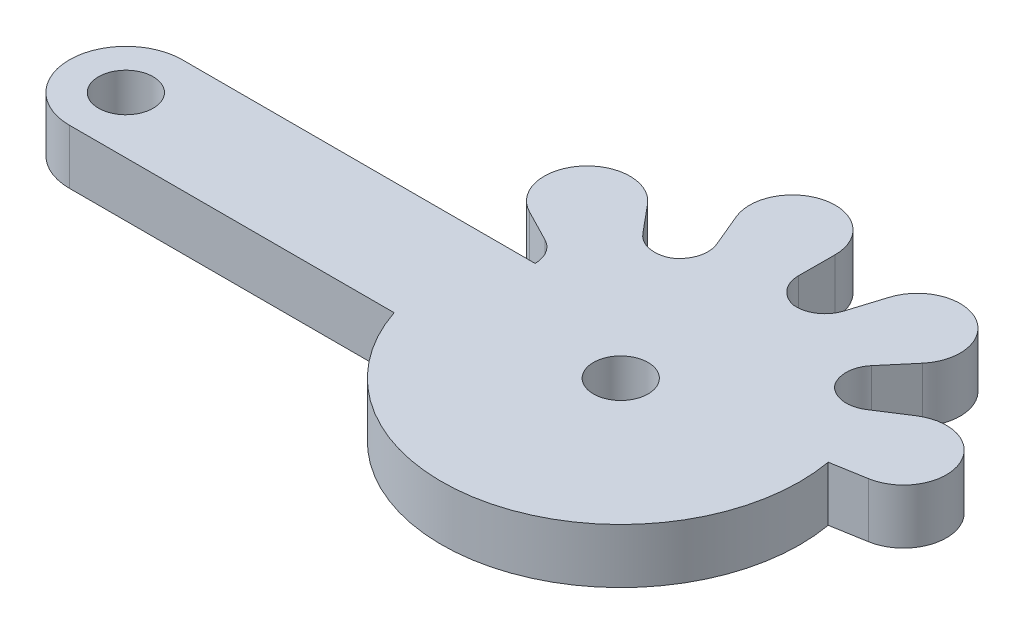
ISO-10303-21;
HEADER;
FILE_DESCRIPTION(('STEP AP214'),'2;1');
FILE_NAME('part.step','',(''),(''),'','','');
FILE_SCHEMA(('AUTOMOTIVE_DESIGN { 1 0 10303 214 1 1 1 1 }'));
ENDSEC;
DATA;
#1=APPLICATION_CONTEXT('core data for automotive mechanical design processes');
#2=APPLICATION_PROTOCOL_DEFINITION('international standard','automotive_design',2000,#1);
#3=PRODUCT_CONTEXT('',#1,'mechanical');
#4=PRODUCT('Part','Part','',(#3));
#5=PRODUCT_RELATED_PRODUCT_CATEGORY('part','',(#4));
#6=PRODUCT_DEFINITION_FORMATION('','',#4);
#7=PRODUCT_DEFINITION_CONTEXT('part definition',#1,'design');
#8=PRODUCT_DEFINITION('design','',#6,#7);
#9=PRODUCT_DEFINITION_SHAPE('','',#8);
#10=(LENGTH_UNIT() NAMED_UNIT(*) SI_UNIT(.MILLI.,.METRE.));
#11=(NAMED_UNIT(*) PLANE_ANGLE_UNIT() SI_UNIT($,.RADIAN.));
#12=(NAMED_UNIT(*) SI_UNIT($,.STERADIAN.) SOLID_ANGLE_UNIT());
#13=UNCERTAINTY_MEASURE_WITH_UNIT(LENGTH_MEASURE(1.E-05),#10,'distance_accuracy_value','');
#14=(GEOMETRIC_REPRESENTATION_CONTEXT(3) GLOBAL_UNCERTAINTY_ASSIGNED_CONTEXT((#13)) GLOBAL_UNIT_ASSIGNED_CONTEXT((#10,
#11,#12)) REPRESENTATION_CONTEXT('',''));
#15=CARTESIAN_POINT('',(0.,0.,0.));
#16=DIRECTION('',(0.,0.,1.));
#17=DIRECTION('',(1.,0.,0.));
#18=AXIS2_PLACEMENT_3D('',#15,#16,#17);
#19=CARTESIAN_POINT('',(-27.1616147689443,3.,0.));
#20=DIRECTION('',(0.,1.,0.));
#21=DIRECTION('',(0.,0.,1.));
#22=AXIS2_PLACEMENT_3D('',#19,#20,#21);
#23=PLANE('',#22);
#24=CARTESIAN_POINT('',(0.,3.,0.));
#25=DIRECTION('',(0.,1.,0.));
#26=DIRECTION('',(0.,0.,1.));
#27=AXIS2_PLACEMENT_3D('',#24,#25,#26);
#28=CIRCLE('',#27,1.5);
#29=CARTESIAN_POINT('',(0.,3.,1.5));
#30=VERTEX_POINT('',#29);
#31=EDGE_CURVE('E224',#30,#30,#28,.T.);
#32=ORIENTED_EDGE('',*,*,#31,.F.);
#33=EDGE_LOOP('',(#32));
#34=FACE_BOUND('',#33,.T.);
#35=CARTESIAN_POINT('',(-27.1616147689443,3.,0.));
#36=DIRECTION('',(0.,1.,0.));
#37=DIRECTION('',(0.,0.,1.));
#38=AXIS2_PLACEMENT_3D('',#35,#36,#37);
#39=CIRCLE('',#38,3.105);
#40=CARTESIAN_POINT('',(-27.1616147689443,3.,-3.105));
#41=VERTEX_POINT('',#40);
#42=CARTESIAN_POINT('',(-27.1616147689443,3.,3.105));
#43=VERTEX_POINT('',#42);
#44=EDGE_CURVE('E265',#41,#43,#39,.T.);
#45=ORIENTED_EDGE('',*,*,#44,.T.);
#46=DIRECTION('',(1.,0.,0.));
#47=VECTOR('',#46,1.);
#48=CARTESIAN_POINT('',(-27.1616147689443,3.,3.105));
#49=LINE('',#48,#47);
#50=CARTESIAN_POINT('',(-9.33199871410192,3.,3.105));
#51=VERTEX_POINT('',#50);
#52=EDGE_CURVE('E138',#43,#51,#49,.T.);
#53=ORIENTED_EDGE('',*,*,#52,.T.);
#54=CARTESIAN_POINT('',(0.,3.,0.));
#55=DIRECTION('',(0.,1.,0.));
#56=DIRECTION('',(0.,0.,1.));
#57=AXIS2_PLACEMENT_3D('',#54,#55,#56);
#58=CIRCLE('',#57,9.835);
#59=CARTESIAN_POINT('',(9.68683946328128,3.,-1.70069580249277));
#60=VERTEX_POINT('',#59);
#61=EDGE_CURVE('E325',#51,#60,#58,.T.);
#62=ORIENTED_EDGE('',*,*,#61,.T.);
#63=DIRECTION('',(0.98547628801862,0.,-0.169813090640984));
#64=VECTOR('',#63,1.);
#65=CARTESIAN_POINT('',(11.5745102547674,3.,-2.02597122018898));
#66=LINE('',#65,#64);
#67=CARTESIAN_POINT('',(11.5745102547674,3.,-2.02597122018898));
#68=VERTEX_POINT('',#67);
#69=EDGE_CURVE('E344',#60,#68,#66,.T.);
#70=ORIENTED_EDGE('',*,*,#69,.T.);
#71=CARTESIAN_POINT('',(11.1748134806221,3.,-4.34553146039787));
#72=DIRECTION('',(0.,1.,0.));
#73=DIRECTION('',(0.,0.,1.));
#74=AXIS2_PLACEMENT_3D('',#71,#72,#73);
#75=CIRCLE('',#74,2.35374535989349);
#76=CARTESIAN_POINT('',(9.90246432928744,3.,-6.32574479645999));
#77=VERTEX_POINT('',#76);
#78=EDGE_CURVE('E341',#68,#77,#75,.T.);
#79=ORIENTED_EDGE('',*,*,#78,.T.);
#80=DIRECTION('',(-0.84130312896367,0.,0.540563636583094));
#81=VECTOR('',#80,1.);
#82=CARTESIAN_POINT('',(8.22739993569904,3.,-5.24946340758131));
#83=LINE('',#82,#81);
#84=CARTESIAN_POINT('',(8.22739993569904,3.,-5.24946340758131));
#85=VERTEX_POINT('',#84);
#86=EDGE_CURVE('E343',#77,#85,#83,.T.);
#87=ORIENTED_EDGE('',*,*,#86,.T.);
#88=CARTESIAN_POINT('',(7.37871502626359,3.,-6.57030932005427));
#89=DIRECTION('',(0.,-1.,0.));
#90=DIRECTION('',(0.,0.,1.));
#91=AXIS2_PLACEMENT_3D('',#88,#89,#90);
#92=CIRCLE('',#91,1.57);
#93=CARTESIAN_POINT('',(6.24896521424157,3.,-5.48009587203768));
#94=VERTEX_POINT('',#93);
#95=EDGE_CURVE('E346',#85,#94,#92,.T.);
#96=ORIENTED_EDGE('',*,*,#95,.T.);
#97=CARTESIAN_POINT('',(7.47733128406035,3.,-6.45785698729946));
#98=DIRECTION('',(0.,-1.,0.));
#99=DIRECTION('',(0.,0.,1.));
#100=AXIS2_PLACEMENT_3D('',#97,#98,#99);
#101=CIRCLE('',#100,1.57);
#102=CARTESIAN_POINT('',(6.27857925846899,3.,-7.47170785460719));
#103=VERTEX_POINT('',#102);
#104=EDGE_CURVE('E352',#94,#103,#101,.T.);
#105=ORIENTED_EDGE('',*,*,#104,.T.);
#106=DIRECTION('',(0.645764883635492,0.,-0.76353632203271));
#107=VECTOR('',#106,1.);
#108=CARTESIAN_POINT('',(7.56432006456824,3.,-8.99193577509988));
#109=LINE('',#108,#107);
#110=CARTESIAN_POINT('',(7.56432006456824,3.,-8.99193577509988));
#111=VERTEX_POINT('',#110);
#112=EDGE_CURVE('E354',#103,#111,#109,.T.);
#113=ORIENTED_EDGE('',*,*,#112,.T.);
#114=CARTESIAN_POINT('',(5.76714998947361,3.,-10.5119018735391));
#115=DIRECTION('',(0.,1.,0.));
#116=DIRECTION('',(0.,0.,1.));
#117=AXIS2_PLACEMENT_3D('',#114,#115,#116);
#118=CIRCLE('',#117,2.35374535989349);
#119=CARTESIAN_POINT('',(3.51961739542973,3.,-11.2109830261462));
#120=VERTEX_POINT('',#119);
#121=EDGE_CURVE('E356',#111,#120,#118,.T.);
#122=ORIENTED_EDGE('',*,*,#121,.T.);
#123=DIRECTION('',(-0.297007979078413,0.,0.954874997245062));
#124=VECTOR('',#123,1.);
#125=CARTESIAN_POINT('',(2.92826396616252,3.,-9.30979301133758));
#126=LINE('',#125,#124);
#127=CARTESIAN_POINT('',(2.92826396616252,3.,-9.30979301133758));
#128=VERTEX_POINT('',#127);
#129=EDGE_CURVE('E358',#120,#128,#126,.T.);
#130=ORIENTED_EDGE('',*,*,#129,.T.);
#131=CARTESIAN_POINT('',(1.42911022048778,3.,-9.77609553849068));
#132=DIRECTION('',(0.,-1.,0.));
#133=DIRECTION('',(0.,0.,1.));
#134=AXIS2_PLACEMENT_3D('',#131,#132,#133);
#135=CIRCLE('',#134,1.57);
#136=CARTESIAN_POINT('',(1.26444735117248,3.,-8.21475440361053));
#137=VERTEX_POINT('',#136);
#138=EDGE_CURVE('E360',#128,#137,#135,.T.);
#139=ORIENTED_EDGE('',*,*,#138,.T.);
#140=CARTESIAN_POINT('',(1.57693762294931,3.,-9.75334136249353));
#141=DIRECTION('',(0.,-1.,0.));
#142=DIRECTION('',(0.,0.,1.));
#143=AXIS2_PLACEMENT_3D('',#140,#141,#142);
#144=CIRCLE('',#143,1.57);
#145=CARTESIAN_POINT('',(0.00694951949208001,3.,-9.75945323640903));
#146=VERTEX_POINT('',#145);
#147=EDGE_CURVE('E362',#137,#146,#144,.T.);
#148=ORIENTED_EDGE('',*,*,#147,.T.);
#149=DIRECTION('',(0.00389291332197502,0.,-0.999992422584225));
#150=VECTOR('',#149,1.);
#151=CARTESIAN_POINT('',(0.0147004481032687,3.,-11.7504736466058));
#152=LINE('',#151,#150);
#153=CARTESIAN_POINT('',(0.0147004481032687,3.,-11.7504736466058));
#154=VERTEX_POINT('',#153);
#155=EDGE_CURVE('E364',#146,#154,#152,.T.);
#156=ORIENTED_EDGE('',*,*,#155,.T.);
#157=CARTESIAN_POINT('',(-2.33902707648301,3.,-11.7596365732738));
#158=DIRECTION('',(0.,1.,0.));
#159=DIRECTION('',(0.,0.,1.));
#160=AXIS2_PLACEMENT_3D('',#157,#158,#159);
#161=CIRCLE('',#160,2.35374535989349);
#162=CARTESIAN_POINT('',(-4.51009763394027,3.,-10.8504777016995));
#163=VERTEX_POINT('',#162);
#164=EDGE_CURVE('E366',#154,#163,#161,.T.);
#165=ORIENTED_EDGE('',*,*,#164,.T.);
#166=DIRECTION('',(0.38626050509368,0.,0.922389734442429));
#167=VECTOR('',#166,1.);
#168=CARTESIAN_POINT('',(-3.74103925717078,3.,-9.01396699826347));
#169=LINE('',#168,#167);
#170=CARTESIAN_POINT('',(-3.74103925717078,3.,-9.01396699826347));
#171=VERTEX_POINT('',#170);
#172=EDGE_CURVE('E368',#163,#171,#169,.T.);
#173=ORIENTED_EDGE('',*,*,#172,.T.);
#174=CARTESIAN_POINT('',(-5.18919114024539,3.,-8.40753800526639));
#175=DIRECTION('',(0.,-1.,0.));
#176=DIRECTION('',(0.,0.,1.));
#177=AXIS2_PLACEMENT_3D('',#174,#175,#176);
#178=CIRCLE('',#177,1.57);
#179=CARTESIAN_POINT('',(-4.31171948027739,3.,-7.10563805290715));
#180=VERTEX_POINT('',#179);
#181=EDGE_CURVE('E370',#171,#180,#178,.T.);
#182=ORIENTED_EDGE('',*,*,#181,.T.);
#183=CARTESIAN_POINT('',(-5.06132267764943,3.,-8.48512891786045));
#184=DIRECTION('',(0.,-1.,0.));
#185=DIRECTION('',(0.,0.,1.));
#186=AXIS2_PLACEMENT_3D('',#183,#184,#185);
#187=CIRCLE('',#186,1.57);
#188=CARTESIAN_POINT('',(-6.26793197689049,3.,-7.48064198465276));
#189=VERTEX_POINT('',#188);
#190=EDGE_CURVE('E372',#180,#189,#187,.T.);
#191=ORIENTED_EDGE('',*,*,#190,.T.);
#192=DIRECTION('',(-0.639800594399805,0.,-0.768540954930612));
#193=VECTOR('',#192,1.);
#194=CARTESIAN_POINT('',(-7.5417976714065,3.,-9.01083430689512));
#195=LINE('',#194,#193);
#196=CARTESIAN_POINT('',(-7.5417976714065,3.,-9.01083430689512));
#197=VERTEX_POINT('',#196);
#198=EDGE_CURVE('E374',#189,#197,#195,.T.);
#199=ORIENTED_EDGE('',*,*,#198,.T.);
#200=CARTESIAN_POINT('',(-9.35074737796255,3.,-7.50490662656948));
#201=DIRECTION('',(0.,1.,0.));
#202=DIRECTION('',(0.,0.,1.));
#203=AXIS2_PLACEMENT_3D('',#200,#201,#202);
#204=CIRCLE('',#203,2.3537453598935);
#205=CARTESIAN_POINT('',(-10.4294878562371,3.,-5.41291327099873));
#206=VERTEX_POINT('',#205);
#207=EDGE_CURVE('E202',#197,#206,#204,.T.);
#208=ORIENTED_EDGE('',*,*,#207,.T.);
#209=DIRECTION('',(0.888793406125044,0.,0.458308063674033));
#210=VECTOR('',#209,1.);
#211=CARTESIAN_POINT('',(-8.65986863505324,3.,-4.50040564761632));
#212=LINE('',#211,#210);
#213=CARTESIAN_POINT('',(-8.65986863505324,3.,-4.50040564761632));
#214=VERTEX_POINT('',#213);
#215=EDGE_CURVE('E196',#206,#214,#212,.T.);
#216=ORIENTED_EDGE('',*,*,#215,.T.);
#217=CARTESIAN_POINT('',(-9.37941229502147,3.,-3.105));
#218=DIRECTION('',(0.,-1.,0.));
#219=DIRECTION('',(0.,0.,1.));
#220=AXIS2_PLACEMENT_3D('',#217,#218,#219);
#221=CIRCLE('',#220,1.57);
#222=CARTESIAN_POINT('',(-7.80941229502147,3.,-3.105));
#223=VERTEX_POINT('',#222);
#224=EDGE_CURVE('E200',#214,#223,#221,.T.);
#225=ORIENTED_EDGE('',*,*,#224,.T.);
#226=DIRECTION('',(-1.,0.,0.));
#227=VECTOR('',#226,1.);
#228=CARTESIAN_POINT('',(-27.1616147689443,3.,-3.105));
#229=LINE('',#228,#227);
#230=EDGE_CURVE('E50',#223,#41,#229,.T.);
#231=ORIENTED_EDGE('',*,*,#230,.T.);
#232=EDGE_LOOP('',(#45,#53,#62,#70,#79,#87,#96,#105,#113,#122,#130,#139,#148,#156,#165,#173,
#182,#191,#199,#208,#216,#225,#231));
#233=FACE_BOUND('',#232,.T.);
#234=CARTESIAN_POINT('',(-27.1616147689443,3.,0.));
#235=DIRECTION('',(0.,1.,0.));
#236=DIRECTION('',(0.,0.,1.));
#237=AXIS2_PLACEMENT_3D('',#234,#235,#236);
#238=CIRCLE('',#237,1.5);
#239=CARTESIAN_POINT('',(-27.1616147689443,3.,1.5));
#240=VERTEX_POINT('',#239);
#241=EDGE_CURVE('E417',#240,#240,#238,.T.);
#242=ORIENTED_EDGE('',*,*,#241,.F.);
#243=EDGE_LOOP('',(#242));
#244=FACE_BOUND('',#243,.T.);
#245=ADVANCED_FACE('F33',(#34,#233,#244),#23,.T.);
#246=CARTESIAN_POINT('',(-27.1616147689443,0.,0.));
#247=DIRECTION('',(0.,1.,0.));
#248=DIRECTION('',(0.,0.,1.));
#249=AXIS2_PLACEMENT_3D('',#246,#247,#248);
#250=PLANE('',#249);
#251=CARTESIAN_POINT('',(0.,0.,0.));
#252=DIRECTION('',(0.,1.,0.));
#253=DIRECTION('',(0.,0.,1.));
#254=AXIS2_PLACEMENT_3D('',#251,#252,#253);
#255=CIRCLE('',#254,1.5);
#256=CARTESIAN_POINT('',(0.,0.,1.5));
#257=VERTEX_POINT('',#256);
#258=EDGE_CURVE('E422',#257,#257,#255,.T.);
#259=ORIENTED_EDGE('',*,*,#258,.T.);
#260=EDGE_LOOP('',(#259));
#261=FACE_BOUND('',#260,.T.);
#262=CARTESIAN_POINT('',(-27.1616147689443,0.,0.));
#263=DIRECTION('',(0.,1.,0.));
#264=DIRECTION('',(0.,0.,1.));
#265=AXIS2_PLACEMENT_3D('',#262,#263,#264);
#266=CIRCLE('',#265,3.105);
#267=CARTESIAN_POINT('',(-27.1616147689443,0.,-3.105));
#268=VERTEX_POINT('',#267);
#269=CARTESIAN_POINT('',(-27.1616147689443,0.,3.105));
#270=VERTEX_POINT('',#269);
#271=EDGE_CURVE('E220',#268,#270,#266,.T.);
#272=ORIENTED_EDGE('',*,*,#271,.F.);
#273=DIRECTION('',(-1.,0.,0.));
#274=VECTOR('',#273,1.);
#275=CARTESIAN_POINT('',(-27.1616147689443,0.,-3.105));
#276=LINE('',#275,#274);
#277=CARTESIAN_POINT('',(-7.80941229502147,0.,-3.105));
#278=VERTEX_POINT('',#277);
#279=EDGE_CURVE('E130',#278,#268,#276,.T.);
#280=ORIENTED_EDGE('',*,*,#279,.F.);
#281=CARTESIAN_POINT('',(-9.37941229502147,0.,-3.105));
#282=DIRECTION('',(0.,-1.,0.));
#283=DIRECTION('',(0.,0.,1.));
#284=AXIS2_PLACEMENT_3D('',#281,#282,#283);
#285=CIRCLE('',#284,1.57);
#286=CARTESIAN_POINT('',(-8.65986863505324,0.,-4.50040564761632));
#287=VERTEX_POINT('',#286);
#288=EDGE_CURVE('E124',#287,#278,#285,.T.);
#289=ORIENTED_EDGE('',*,*,#288,.F.);
#290=DIRECTION('',(0.888793406125044,0.,0.458308063674033));
#291=VECTOR('',#290,1.);
#292=CARTESIAN_POINT('',(-8.65986863505324,0.,-4.50040564761632));
#293=LINE('',#292,#291);
#294=CARTESIAN_POINT('',(-10.4294878562371,0.,-5.41291327099873));
#295=VERTEX_POINT('',#294);
#296=EDGE_CURVE('E210',#295,#287,#293,.T.);
#297=ORIENTED_EDGE('',*,*,#296,.F.);
#298=CARTESIAN_POINT('',(-9.35074737796255,0.,-7.50490662656948));
#299=DIRECTION('',(0.,1.,0.));
#300=DIRECTION('',(0.,0.,1.));
#301=AXIS2_PLACEMENT_3D('',#298,#299,#300);
#302=CIRCLE('',#301,2.3537453598935);
#303=CARTESIAN_POINT('',(-7.5417976714065,0.,-9.01083430689512));
#304=VERTEX_POINT('',#303);
#305=EDGE_CURVE('E260',#304,#295,#302,.T.);
#306=ORIENTED_EDGE('',*,*,#305,.F.);
#307=DIRECTION('',(-0.639800594399805,0.,-0.768540954930612));
#308=VECTOR('',#307,1.);
#309=CARTESIAN_POINT('',(-7.5417976714065,0.,-9.01083430689512));
#310=LINE('',#309,#308);
#311=CARTESIAN_POINT('',(-6.26793197689049,0.,-7.48064198465276));
#312=VERTEX_POINT('',#311);
#313=EDGE_CURVE('E258',#312,#304,#310,.T.);
#314=ORIENTED_EDGE('',*,*,#313,.F.);
#315=CARTESIAN_POINT('',(-5.06132267764943,0.,-8.48512891786045));
#316=DIRECTION('',(0.,-1.,0.));
#317=DIRECTION('',(0.,0.,1.));
#318=AXIS2_PLACEMENT_3D('',#315,#316,#317);
#319=CIRCLE('',#318,1.57);
#320=CARTESIAN_POINT('',(-4.31171948027739,0.,-7.10563805290715));
#321=VERTEX_POINT('',#320);
#322=EDGE_CURVE('E256',#321,#312,#319,.T.);
#323=ORIENTED_EDGE('',*,*,#322,.F.);
#324=CARTESIAN_POINT('',(-5.18919114024539,0.,-8.40753800526639));
#325=DIRECTION('',(0.,-1.,0.));
#326=DIRECTION('',(0.,0.,1.));
#327=AXIS2_PLACEMENT_3D('',#324,#325,#326);
#328=CIRCLE('',#327,1.57);
#329=CARTESIAN_POINT('',(-3.74103925717078,0.,-9.01396699826347));
#330=VERTEX_POINT('',#329);
#331=EDGE_CURVE('E254',#330,#321,#328,.T.);
#332=ORIENTED_EDGE('',*,*,#331,.F.);
#333=DIRECTION('',(0.38626050509368,0.,0.922389734442429));
#334=VECTOR('',#333,1.);
#335=CARTESIAN_POINT('',(-3.74103925717078,0.,-9.01396699826347));
#336=LINE('',#335,#334);
#337=CARTESIAN_POINT('',(-4.51009763394027,0.,-10.8504777016995));
#338=VERTEX_POINT('',#337);
#339=EDGE_CURVE('E252',#338,#330,#336,.T.);
#340=ORIENTED_EDGE('',*,*,#339,.F.);
#341=CARTESIAN_POINT('',(-2.33902707648301,0.,-11.7596365732738));
#342=DIRECTION('',(0.,1.,0.));
#343=DIRECTION('',(0.,0.,1.));
#344=AXIS2_PLACEMENT_3D('',#341,#342,#343);
#345=CIRCLE('',#344,2.35374535989349);
#346=CARTESIAN_POINT('',(0.0147004481032687,0.,-11.7504736466058));
#347=VERTEX_POINT('',#346);
#348=EDGE_CURVE('E250',#347,#338,#345,.T.);
#349=ORIENTED_EDGE('',*,*,#348,.F.);
#350=DIRECTION('',(0.00389291332197502,0.,-0.999992422584225));
#351=VECTOR('',#350,1.);
#352=CARTESIAN_POINT('',(0.0147004481032687,0.,-11.7504736466058));
#353=LINE('',#352,#351);
#354=CARTESIAN_POINT('',(0.00694951949208001,0.,-9.75945323640903));
#355=VERTEX_POINT('',#354);
#356=EDGE_CURVE('E248',#355,#347,#353,.T.);
#357=ORIENTED_EDGE('',*,*,#356,.F.);
#358=CARTESIAN_POINT('',(1.57693762294931,0.,-9.75334136249353));
#359=DIRECTION('',(0.,-1.,0.));
#360=DIRECTION('',(0.,0.,1.));
#361=AXIS2_PLACEMENT_3D('',#358,#359,#360);
#362=CIRCLE('',#361,1.57);
#363=CARTESIAN_POINT('',(1.26444735117248,0.,-8.21475440361053));
#364=VERTEX_POINT('',#363);
#365=EDGE_CURVE('E246',#364,#355,#362,.T.);
#366=ORIENTED_EDGE('',*,*,#365,.F.);
#367=CARTESIAN_POINT('',(1.42911022048778,0.,-9.77609553849068));
#368=DIRECTION('',(0.,-1.,0.));
#369=DIRECTION('',(0.,0.,1.));
#370=AXIS2_PLACEMENT_3D('',#367,#368,#369);
#371=CIRCLE('',#370,1.57);
#372=CARTESIAN_POINT('',(2.92826396616252,0.,-9.30979301133758));
#373=VERTEX_POINT('',#372);
#374=EDGE_CURVE('E244',#373,#364,#371,.T.);
#375=ORIENTED_EDGE('',*,*,#374,.F.);
#376=DIRECTION('',(-0.297007979078413,0.,0.954874997245062));
#377=VECTOR('',#376,1.);
#378=CARTESIAN_POINT('',(2.92826396616252,0.,-9.30979301133758));
#379=LINE('',#378,#377);
#380=CARTESIAN_POINT('',(3.51961739542973,0.,-11.2109830261462));
#381=VERTEX_POINT('',#380);
#382=EDGE_CURVE('E242',#381,#373,#379,.T.);
#383=ORIENTED_EDGE('',*,*,#382,.F.);
#384=CARTESIAN_POINT('',(5.76714998947361,0.,-10.5119018735391));
#385=DIRECTION('',(0.,1.,0.));
#386=DIRECTION('',(0.,0.,1.));
#387=AXIS2_PLACEMENT_3D('',#384,#385,#386);
#388=CIRCLE('',#387,2.35374535989349);
#389=CARTESIAN_POINT('',(7.56432006456824,0.,-8.99193577509988));
#390=VERTEX_POINT('',#389);
#391=EDGE_CURVE('E240',#390,#381,#388,.T.);
#392=ORIENTED_EDGE('',*,*,#391,.F.);
#393=DIRECTION('',(0.645764883635492,0.,-0.76353632203271));
#394=VECTOR('',#393,1.);
#395=CARTESIAN_POINT('',(7.56432006456824,0.,-8.99193577509988));
#396=LINE('',#395,#394);
#397=CARTESIAN_POINT('',(6.27857925846899,0.,-7.47170785460719));
#398=VERTEX_POINT('',#397);
#399=EDGE_CURVE('E238',#398,#390,#396,.T.);
#400=ORIENTED_EDGE('',*,*,#399,.F.);
#401=CARTESIAN_POINT('',(7.47733128406035,0.,-6.45785698729946));
#402=DIRECTION('',(0.,-1.,0.));
#403=DIRECTION('',(0.,0.,1.));
#404=AXIS2_PLACEMENT_3D('',#401,#402,#403);
#405=CIRCLE('',#404,1.57);
#406=CARTESIAN_POINT('',(6.24896521424157,0.,-5.48009587203768));
#407=VERTEX_POINT('',#406);
#408=EDGE_CURVE('E236',#407,#398,#405,.T.);
#409=ORIENTED_EDGE('',*,*,#408,.F.);
#410=CARTESIAN_POINT('',(7.37871502626359,0.,-6.57030932005427));
#411=DIRECTION('',(0.,-1.,0.));
#412=DIRECTION('',(0.,0.,1.));
#413=AXIS2_PLACEMENT_3D('',#410,#411,#412);
#414=CIRCLE('',#413,1.57);
#415=CARTESIAN_POINT('',(8.22739993569904,0.,-5.24946340758131));
#416=VERTEX_POINT('',#415);
#417=EDGE_CURVE('E234',#416,#407,#414,.T.);
#418=ORIENTED_EDGE('',*,*,#417,.F.);
#419=DIRECTION('',(-0.84130312896367,0.,0.540563636583094));
#420=VECTOR('',#419,1.);
#421=CARTESIAN_POINT('',(8.22739993569904,0.,-5.24946340758131));
#422=LINE('',#421,#420);
#423=CARTESIAN_POINT('',(9.90246432928744,0.,-6.32574479645999));
#424=VERTEX_POINT('',#423);
#425=EDGE_CURVE('E232',#424,#416,#422,.T.);
#426=ORIENTED_EDGE('',*,*,#425,.F.);
#427=CARTESIAN_POINT('',(11.1748134806221,0.,-4.34553146039787));
#428=DIRECTION('',(0.,1.,0.));
#429=DIRECTION('',(0.,0.,1.));
#430=AXIS2_PLACEMENT_3D('',#427,#428,#429);
#431=CIRCLE('',#430,2.35374535989349);
#432=CARTESIAN_POINT('',(11.5745102547674,0.,-2.02597122018898));
#433=VERTEX_POINT('',#432);
#434=EDGE_CURVE('E230',#433,#424,#431,.T.);
#435=ORIENTED_EDGE('',*,*,#434,.F.);
#436=DIRECTION('',(0.98547628801862,0.,-0.169813090640984));
#437=VECTOR('',#436,1.);
#438=CARTESIAN_POINT('',(11.5745102547674,0.,-2.02597122018898));
#439=LINE('',#438,#437);
#440=CARTESIAN_POINT('',(9.68683946328128,0.,-1.70069580249277));
#441=VERTEX_POINT('',#440);
#442=EDGE_CURVE('E228',#441,#433,#439,.T.);
#443=ORIENTED_EDGE('',*,*,#442,.F.);
#444=CARTESIAN_POINT('',(0.,0.,0.));
#445=DIRECTION('',(0.,1.,0.));
#446=DIRECTION('',(0.,0.,1.));
#447=AXIS2_PLACEMENT_3D('',#444,#445,#446);
#448=CIRCLE('',#447,9.835);
#449=CARTESIAN_POINT('',(-9.33199871410192,0.,3.105));
#450=VERTEX_POINT('',#449);
#451=EDGE_CURVE('E226',#450,#441,#448,.T.);
#452=ORIENTED_EDGE('',*,*,#451,.F.);
#453=DIRECTION('',(1.,0.,0.));
#454=VECTOR('',#453,1.);
#455=CARTESIAN_POINT('',(-27.1616147689443,0.,3.105));
#456=LINE('',#455,#454);
#457=EDGE_CURVE('E223',#270,#450,#456,.T.);
#458=ORIENTED_EDGE('',*,*,#457,.F.);
#459=EDGE_LOOP('',(#272,#280,#289,#297,#306,#314,#323,#332,#340,#349,#357,#366,#375,#383,#392,
#400,#409,#418,#426,#435,#443,#452,#458));
#460=FACE_BOUND('',#459,.T.);
#461=CARTESIAN_POINT('',(-27.1616147689443,0.,0.));
#462=DIRECTION('',(0.,1.,0.));
#463=DIRECTION('',(0.,0.,1.));
#464=AXIS2_PLACEMENT_3D('',#461,#462,#463);
#465=CIRCLE('',#464,1.5);
#466=CARTESIAN_POINT('',(-27.1616147689443,0.,1.5));
#467=VERTEX_POINT('',#466);
#468=EDGE_CURVE('E420',#467,#467,#465,.T.);
#469=ORIENTED_EDGE('',*,*,#468,.T.);
#470=EDGE_LOOP('',(#469));
#471=FACE_BOUND('',#470,.T.);
#472=ADVANCED_FACE('F329',(#261,#460,#471),#250,.F.);
#473=CARTESIAN_POINT('',(-27.1616147689443,3.,0.));
#474=DIRECTION('',(0.,-1.,0.));
#475=DIRECTION('',(0.,0.,-1.));
#476=AXIS2_PLACEMENT_3D('',#473,#474,#475);
#477=CYLINDRICAL_SURFACE('',#476,3.105);
#478=ORIENTED_EDGE('',*,*,#271,.T.);
#479=DIRECTION('',(0.,-1.,0.));
#480=VECTOR('',#479,1.);
#481=CARTESIAN_POINT('',(-27.1616147689443,3.,3.105));
#482=LINE('',#481,#480);
#483=EDGE_CURVE('E11',#43,#270,#482,.T.);
#484=ORIENTED_EDGE('',*,*,#483,.F.);
#485=ORIENTED_EDGE('',*,*,#44,.F.);
#486=DIRECTION('',(0.,-1.,0.));
#487=VECTOR('',#486,1.);
#488=CARTESIAN_POINT('',(-27.1616147689443,3.,-3.105));
#489=LINE('',#488,#487);
#490=EDGE_CURVE('E216',#41,#268,#489,.T.);
#491=ORIENTED_EDGE('',*,*,#490,.T.);
#492=EDGE_LOOP('',(#478,#484,#485,#491));
#493=FACE_BOUND('',#492,.T.);
#494=ADVANCED_FACE('F35',(#493),#477,.T.);
#495=CARTESIAN_POINT('',(-27.1616147689443,3.,3.105));
#496=DIRECTION('',(0.,0.,-1.));
#497=DIRECTION('',(-1.,0.,0.));
#498=AXIS2_PLACEMENT_3D('',#495,#496,#497);
#499=PLANE('',#498);
#500=ORIENTED_EDGE('',*,*,#457,.T.);
#501=DIRECTION('',(0.,-1.,0.));
#502=VECTOR('',#501,1.);
#503=CARTESIAN_POINT('',(-9.33199871410192,3.,3.105));
#504=LINE('',#503,#502);
#505=EDGE_CURVE('E42',#51,#450,#504,.T.);
#506=ORIENTED_EDGE('',*,*,#505,.F.);
#507=ORIENTED_EDGE('',*,*,#52,.F.);
#508=ORIENTED_EDGE('',*,*,#483,.T.);
#509=EDGE_LOOP('',(#500,#506,#507,#508));
#510=FACE_BOUND('',#509,.T.);
#511=ADVANCED_FACE('F625',(#510),#499,.F.);
#512=CARTESIAN_POINT('',(0.,3.,0.));
#513=DIRECTION('',(0.,-1.,0.));
#514=DIRECTION('',(0.,0.,-1.));
#515=AXIS2_PLACEMENT_3D('',#512,#513,#514);
#516=CYLINDRICAL_SURFACE('',#515,9.835);
#517=ORIENTED_EDGE('',*,*,#451,.T.);
#518=DIRECTION('',(0.,-1.,0.));
#519=VECTOR('',#518,1.);
#520=CARTESIAN_POINT('',(9.68683946328128,3.,-1.70069580249277));
#521=LINE('',#520,#519);
#522=EDGE_CURVE('E317',#60,#441,#521,.T.);
#523=ORIENTED_EDGE('',*,*,#522,.F.);
#524=ORIENTED_EDGE('',*,*,#61,.F.);
#525=ORIENTED_EDGE('',*,*,#505,.T.);
#526=EDGE_LOOP('',(#517,#523,#524,#525));
#527=FACE_BOUND('',#526,.T.);
#528=ADVANCED_FACE('F323',(#527),#516,.T.);
#529=CARTESIAN_POINT('',(11.5745102547674,3.,-2.02597122018898));
#530=DIRECTION('',(-0.169813090640984,0.,-0.985476288018619));
#531=DIRECTION('',(-0.98547628801862,0.,0.169813090640984));
#532=AXIS2_PLACEMENT_3D('',#529,#530,#531);
#533=PLANE('',#532);
#534=ORIENTED_EDGE('',*,*,#442,.T.);
#535=DIRECTION('',(0.,-1.,0.));
#536=VECTOR('',#535,1.);
#537=CARTESIAN_POINT('',(11.5745102547674,3.,-2.02597122018898));
#538=LINE('',#537,#536);
#539=EDGE_CURVE('E314',#68,#433,#538,.T.);
#540=ORIENTED_EDGE('',*,*,#539,.F.);
#541=ORIENTED_EDGE('',*,*,#69,.F.);
#542=ORIENTED_EDGE('',*,*,#522,.T.);
#543=EDGE_LOOP('',(#534,#540,#541,#542));
#544=FACE_BOUND('',#543,.T.);
#545=ADVANCED_FACE('F335',(#544),#533,.F.);
#546=CARTESIAN_POINT('',(11.1748134806221,3.,-4.34553146039787));
#547=DIRECTION('',(0.,-1.,0.));
#548=DIRECTION('',(0.,0.,-1.));
#549=AXIS2_PLACEMENT_3D('',#546,#547,#548);
#550=CYLINDRICAL_SURFACE('',#549,2.35374535989349);
#551=ORIENTED_EDGE('',*,*,#434,.T.);
#552=DIRECTION('',(0.,-1.,0.));
#553=VECTOR('',#552,1.);
#554=CARTESIAN_POINT('',(9.90246432928744,3.,-6.32574479645999));
#555=LINE('',#554,#553);
#556=EDGE_CURVE('E311',#77,#424,#555,.T.);
#557=ORIENTED_EDGE('',*,*,#556,.F.);
#558=ORIENTED_EDGE('',*,*,#78,.F.);
#559=ORIENTED_EDGE('',*,*,#539,.T.);
#560=EDGE_LOOP('',(#551,#557,#558,#559));
#561=FACE_BOUND('',#560,.T.);
#562=ADVANCED_FACE('F339',(#561),#550,.T.);
#563=CARTESIAN_POINT('',(8.22739993569904,3.,-5.24946340758131));
#564=DIRECTION('',(0.540563636583094,0.,0.84130312896367));
#565=DIRECTION('',(0.84130312896367,0.,-0.540563636583094));
#566=AXIS2_PLACEMENT_3D('',#563,#564,#565);
#567=PLANE('',#566);
#568=ORIENTED_EDGE('',*,*,#425,.T.);
#569=DIRECTION('',(0.,-1.,0.));
#570=VECTOR('',#569,1.);
#571=CARTESIAN_POINT('',(8.22739993569904,3.,-5.24946340758131));
#572=LINE('',#571,#570);
#573=EDGE_CURVE('E308',#85,#416,#572,.T.);
#574=ORIENTED_EDGE('',*,*,#573,.F.);
#575=ORIENTED_EDGE('',*,*,#86,.F.);
#576=ORIENTED_EDGE('',*,*,#556,.T.);
#577=EDGE_LOOP('',(#568,#574,#575,#576));
#578=FACE_BOUND('',#577,.T.);
#579=ADVANCED_FACE('F590',(#578),#567,.F.);
#580=CARTESIAN_POINT('',(7.37871502626359,3.,-6.57030932005427));
#581=DIRECTION('',(0.,-1.,0.));
#582=DIRECTION('',(0.,0.,-1.));
#583=AXIS2_PLACEMENT_3D('',#580,#581,#582);
#584=CYLINDRICAL_SURFACE('',#583,1.57);
#585=ORIENTED_EDGE('',*,*,#417,.T.);
#586=DIRECTION('',(0.,-1.,0.));
#587=VECTOR('',#586,1.);
#588=CARTESIAN_POINT('',(6.24896521424157,3.,-5.48009587203768));
#589=LINE('',#588,#587);
#590=EDGE_CURVE('E305',#94,#407,#589,.T.);
#591=ORIENTED_EDGE('',*,*,#590,.F.);
#592=ORIENTED_EDGE('',*,*,#95,.F.);
#593=ORIENTED_EDGE('',*,*,#573,.T.);
#594=EDGE_LOOP('',(#585,#591,#592,#593));
#595=FACE_BOUND('',#594,.T.);
#596=ADVANCED_FACE('F580',(#595),#584,.F.);
#597=CARTESIAN_POINT('',(7.47733128406035,3.,-6.45785698729946));
#598=DIRECTION('',(0.,-1.,0.));
#599=DIRECTION('',(0.,0.,-1.));
#600=AXIS2_PLACEMENT_3D('',#597,#598,#599);
#601=CYLINDRICAL_SURFACE('',#600,1.57);
#602=ORIENTED_EDGE('',*,*,#408,.T.);
#603=DIRECTION('',(0.,-1.,0.));
#604=VECTOR('',#603,1.);
#605=CARTESIAN_POINT('',(6.27857925846899,3.,-7.47170785460719));
#606=LINE('',#605,#604);
#607=EDGE_CURVE('E302',#103,#398,#606,.T.);
#608=ORIENTED_EDGE('',*,*,#607,.F.);
#609=ORIENTED_EDGE('',*,*,#104,.F.);
#610=ORIENTED_EDGE('',*,*,#590,.T.);
#611=EDGE_LOOP('',(#602,#608,#609,#610));
#612=FACE_BOUND('',#611,.T.);
#613=ADVANCED_FACE('F570',(#612),#601,.F.);
#614=CARTESIAN_POINT('',(7.56432006456824,3.,-8.99193577509988));
#615=DIRECTION('',(-0.76353632203271,0.,-0.645764883635493));
#616=DIRECTION('',(-0.645764883635493,0.,0.76353632203271));
#617=AXIS2_PLACEMENT_3D('',#614,#615,#616);
#618=PLANE('',#617);
#619=ORIENTED_EDGE('',*,*,#399,.T.);
#620=DIRECTION('',(0.,-1.,0.));
#621=VECTOR('',#620,1.);
#622=CARTESIAN_POINT('',(7.56432006456824,3.,-8.99193577509988));
#623=LINE('',#622,#621);
#624=EDGE_CURVE('E299',#111,#390,#623,.T.);
#625=ORIENTED_EDGE('',*,*,#624,.F.);
#626=ORIENTED_EDGE('',*,*,#112,.F.);
#627=ORIENTED_EDGE('',*,*,#607,.T.);
#628=EDGE_LOOP('',(#619,#625,#626,#627));
#629=FACE_BOUND('',#628,.T.);
#630=ADVANCED_FACE('F560',(#629),#618,.F.);
#631=CARTESIAN_POINT('',(5.76714998947361,3.,-10.5119018735391));
#632=DIRECTION('',(0.,-1.,0.));
#633=DIRECTION('',(0.,0.,-1.));
#634=AXIS2_PLACEMENT_3D('',#631,#632,#633);
#635=CYLINDRICAL_SURFACE('',#634,2.35374535989349);
#636=ORIENTED_EDGE('',*,*,#391,.T.);
#637=DIRECTION('',(0.,-1.,0.));
#638=VECTOR('',#637,1.);
#639=CARTESIAN_POINT('',(3.51961739542973,3.,-11.2109830261462));
#640=LINE('',#639,#638);
#641=EDGE_CURVE('E296',#120,#381,#640,.T.);
#642=ORIENTED_EDGE('',*,*,#641,.F.);
#643=ORIENTED_EDGE('',*,*,#121,.F.);
#644=ORIENTED_EDGE('',*,*,#624,.T.);
#645=EDGE_LOOP('',(#636,#642,#643,#644));
#646=FACE_BOUND('',#645,.T.);
#647=ADVANCED_FACE('F550',(#646),#635,.T.);
#648=CARTESIAN_POINT('',(2.92826396616252,3.,-9.30979301133758));
#649=DIRECTION('',(0.954874997245062,0.,0.297007979078413));
#650=DIRECTION('',(0.297007979078413,0.,-0.954874997245062));
#651=AXIS2_PLACEMENT_3D('',#648,#649,#650);
#652=PLANE('',#651);
#653=ORIENTED_EDGE('',*,*,#382,.T.);
#654=DIRECTION('',(0.,-1.,0.));
#655=VECTOR('',#654,1.);
#656=CARTESIAN_POINT('',(2.92826396616252,3.,-9.30979301133758));
#657=LINE('',#656,#655);
#658=EDGE_CURVE('E293',#128,#373,#657,.T.);
#659=ORIENTED_EDGE('',*,*,#658,.F.);
#660=ORIENTED_EDGE('',*,*,#129,.F.);
#661=ORIENTED_EDGE('',*,*,#641,.T.);
#662=EDGE_LOOP('',(#653,#659,#660,#661));
#663=FACE_BOUND('',#662,.T.);
#664=ADVANCED_FACE('F540',(#663),#652,.F.);
#665=CARTESIAN_POINT('',(1.42911022048778,3.,-9.77609553849068));
#666=DIRECTION('',(0.,-1.,0.));
#667=DIRECTION('',(0.,0.,-1.));
#668=AXIS2_PLACEMENT_3D('',#665,#666,#667);
#669=CYLINDRICAL_SURFACE('',#668,1.57);
#670=ORIENTED_EDGE('',*,*,#374,.T.);
#671=DIRECTION('',(0.,-1.,0.));
#672=VECTOR('',#671,1.);
#673=CARTESIAN_POINT('',(1.26444735117248,3.,-8.21475440361053));
#674=LINE('',#673,#672);
#675=EDGE_CURVE('E290',#137,#364,#674,.T.);
#676=ORIENTED_EDGE('',*,*,#675,.F.);
#677=ORIENTED_EDGE('',*,*,#138,.F.);
#678=ORIENTED_EDGE('',*,*,#658,.T.);
#679=EDGE_LOOP('',(#670,#676,#677,#678));
#680=FACE_BOUND('',#679,.T.);
#681=ADVANCED_FACE('F530',(#680),#669,.F.);
#682=CARTESIAN_POINT('',(1.57693762294931,3.,-9.75334136249353));
#683=DIRECTION('',(0.,-1.,0.));
#684=DIRECTION('',(0.,0.,-1.));
#685=AXIS2_PLACEMENT_3D('',#682,#683,#684);
#686=CYLINDRICAL_SURFACE('',#685,1.57);
#687=ORIENTED_EDGE('',*,*,#365,.T.);
#688=DIRECTION('',(0.,-1.,0.));
#689=VECTOR('',#688,1.);
#690=CARTESIAN_POINT('',(0.00694951949208001,3.,-9.75945323640903));
#691=LINE('',#690,#689);
#692=EDGE_CURVE('E287',#146,#355,#691,.T.);
#693=ORIENTED_EDGE('',*,*,#692,.F.);
#694=ORIENTED_EDGE('',*,*,#147,.F.);
#695=ORIENTED_EDGE('',*,*,#675,.T.);
#696=EDGE_LOOP('',(#687,#693,#694,#695));
#697=FACE_BOUND('',#696,.T.);
#698=ADVANCED_FACE('F520',(#697),#686,.F.);
#699=CARTESIAN_POINT('',(0.0147004481032687,3.,-11.7504736466058));
#700=DIRECTION('',(-0.999992422584225,0.,-0.00389291332197502));
#701=DIRECTION('',(-0.00389291332197502,0.,0.999992422584225));
#702=AXIS2_PLACEMENT_3D('',#699,#700,#701);
#703=PLANE('',#702);
#704=ORIENTED_EDGE('',*,*,#356,.T.);
#705=DIRECTION('',(0.,-1.,0.));
#706=VECTOR('',#705,1.);
#707=CARTESIAN_POINT('',(0.0147004481032687,3.,-11.7504736466058));
#708=LINE('',#707,#706);
#709=EDGE_CURVE('E284',#154,#347,#708,.T.);
#710=ORIENTED_EDGE('',*,*,#709,.F.);
#711=ORIENTED_EDGE('',*,*,#155,.F.);
#712=ORIENTED_EDGE('',*,*,#692,.T.);
#713=EDGE_LOOP('',(#704,#710,#711,#712));
#714=FACE_BOUND('',#713,.T.);
#715=ADVANCED_FACE('F510',(#714),#703,.F.);
#716=CARTESIAN_POINT('',(-2.33902707648301,3.,-11.7596365732738));
#717=DIRECTION('',(0.,-1.,0.));
#718=DIRECTION('',(0.,0.,-1.));
#719=AXIS2_PLACEMENT_3D('',#716,#717,#718);
#720=CYLINDRICAL_SURFACE('',#719,2.35374535989349);
#721=ORIENTED_EDGE('',*,*,#348,.T.);
#722=DIRECTION('',(0.,-1.,0.));
#723=VECTOR('',#722,1.);
#724=CARTESIAN_POINT('',(-4.51009763394027,3.,-10.8504777016995));
#725=LINE('',#724,#723);
#726=EDGE_CURVE('E281',#163,#338,#725,.T.);
#727=ORIENTED_EDGE('',*,*,#726,.F.);
#728=ORIENTED_EDGE('',*,*,#164,.F.);
#729=ORIENTED_EDGE('',*,*,#709,.T.);
#730=EDGE_LOOP('',(#721,#727,#728,#729));
#731=FACE_BOUND('',#730,.T.);
#732=ADVANCED_FACE('F500',(#731),#720,.T.);
#733=CARTESIAN_POINT('',(-3.74103925717078,3.,-9.01396699826347));
#734=DIRECTION('',(0.922389734442429,0.,-0.38626050509368));
#735=DIRECTION('',(-0.38626050509368,0.,-0.922389734442429));
#736=AXIS2_PLACEMENT_3D('',#733,#734,#735);
#737=PLANE('',#736);
#738=ORIENTED_EDGE('',*,*,#339,.T.);
#739=DIRECTION('',(0.,-1.,0.));
#740=VECTOR('',#739,1.);
#741=CARTESIAN_POINT('',(-3.74103925717078,3.,-9.01396699826347));
#742=LINE('',#741,#740);
#743=EDGE_CURVE('E278',#171,#330,#742,.T.);
#744=ORIENTED_EDGE('',*,*,#743,.F.);
#745=ORIENTED_EDGE('',*,*,#172,.F.);
#746=ORIENTED_EDGE('',*,*,#726,.T.);
#747=EDGE_LOOP('',(#738,#744,#745,#746));
#748=FACE_BOUND('',#747,.T.);
#749=ADVANCED_FACE('F490',(#748),#737,.F.);
#750=CARTESIAN_POINT('',(-5.18919114024539,3.,-8.40753800526639));
#751=DIRECTION('',(0.,-1.,0.));
#752=DIRECTION('',(0.,0.,-1.));
#753=AXIS2_PLACEMENT_3D('',#750,#751,#752);
#754=CYLINDRICAL_SURFACE('',#753,1.57);
#755=ORIENTED_EDGE('',*,*,#331,.T.);
#756=DIRECTION('',(0.,-1.,0.));
#757=VECTOR('',#756,1.);
#758=CARTESIAN_POINT('',(-4.31171948027739,3.,-7.10563805290715));
#759=LINE('',#758,#757);
#760=EDGE_CURVE('E275',#180,#321,#759,.T.);
#761=ORIENTED_EDGE('',*,*,#760,.F.);
#762=ORIENTED_EDGE('',*,*,#181,.F.);
#763=ORIENTED_EDGE('',*,*,#743,.T.);
#764=EDGE_LOOP('',(#755,#761,#762,#763));
#765=FACE_BOUND('',#764,.T.);
#766=ADVANCED_FACE('F480',(#765),#754,.F.);
#767=CARTESIAN_POINT('',(-5.06132267764943,3.,-8.48512891786045));
#768=DIRECTION('',(0.,-1.,0.));
#769=DIRECTION('',(0.,0.,-1.));
#770=AXIS2_PLACEMENT_3D('',#767,#768,#769);
#771=CYLINDRICAL_SURFACE('',#770,1.57);
#772=ORIENTED_EDGE('',*,*,#322,.T.);
#773=DIRECTION('',(0.,-1.,0.));
#774=VECTOR('',#773,1.);
#775=CARTESIAN_POINT('',(-6.26793197689049,3.,-7.48064198465276));
#776=LINE('',#775,#774);
#777=EDGE_CURVE('E272',#189,#312,#776,.T.);
#778=ORIENTED_EDGE('',*,*,#777,.F.);
#779=ORIENTED_EDGE('',*,*,#190,.F.);
#780=ORIENTED_EDGE('',*,*,#760,.T.);
#781=EDGE_LOOP('',(#772,#778,#779,#780));
#782=FACE_BOUND('',#781,.T.);
#783=ADVANCED_FACE('F471',(#782),#771,.F.);
#784=CARTESIAN_POINT('',(-7.5417976714065,3.,-9.01083430689512));
#785=DIRECTION('',(-0.768540954930612,0.,0.639800594399805));
#786=DIRECTION('',(0.639800594399805,0.,0.768540954930612));
#787=AXIS2_PLACEMENT_3D('',#784,#785,#786);
#788=PLANE('',#787);
#789=ORIENTED_EDGE('',*,*,#313,.T.);
#790=DIRECTION('',(0.,-1.,0.));
#791=VECTOR('',#790,1.);
#792=CARTESIAN_POINT('',(-7.5417976714065,3.,-9.01083430689512));
#793=LINE('',#792,#791);
#794=EDGE_CURVE('E269',#197,#304,#793,.T.);
#795=ORIENTED_EDGE('',*,*,#794,.F.);
#796=ORIENTED_EDGE('',*,*,#198,.F.);
#797=ORIENTED_EDGE('',*,*,#777,.T.);
#798=EDGE_LOOP('',(#789,#795,#796,#797));
#799=FACE_BOUND('',#798,.T.);
#800=ADVANCED_FACE('F380',(#799),#788,.F.);
#801=CARTESIAN_POINT('',(-9.35074737796255,3.,-7.50490662656948));
#802=DIRECTION('',(0.,-1.,0.));
#803=DIRECTION('',(0.,0.,-1.));
#804=AXIS2_PLACEMENT_3D('',#801,#802,#803);
#805=CYLINDRICAL_SURFACE('',#804,2.3537453598935);
#806=ORIENTED_EDGE('',*,*,#305,.T.);
#807=DIRECTION('',(0.,-1.,0.));
#808=VECTOR('',#807,1.);
#809=CARTESIAN_POINT('',(-10.4294878562371,3.,-5.41291327099873));
#810=LINE('',#809,#808);
#811=EDGE_CURVE('E211',#206,#295,#810,.T.);
#812=ORIENTED_EDGE('',*,*,#811,.F.);
#813=ORIENTED_EDGE('',*,*,#207,.F.);
#814=ORIENTED_EDGE('',*,*,#794,.T.);
#815=EDGE_LOOP('',(#806,#812,#813,#814));
#816=FACE_BOUND('',#815,.T.);
#817=ADVANCED_FACE('F384',(#816),#805,.T.);
#818=CARTESIAN_POINT('',(-8.65986863505324,3.,-4.50040564761632));
#819=DIRECTION('',(0.458308063674033,0.,-0.888793406125044));
#820=DIRECTION('',(-0.888793406125045,0.,-0.458308063674033));
#821=AXIS2_PLACEMENT_3D('',#818,#819,#820);
#822=PLANE('',#821);
#823=ORIENTED_EDGE('',*,*,#296,.T.);
#824=DIRECTION('',(0.,-1.,0.));
#825=VECTOR('',#824,1.);
#826=CARTESIAN_POINT('',(-8.65986863505324,3.,-4.50040564761632));
#827=LINE('',#826,#825);
#828=EDGE_CURVE('E207',#214,#287,#827,.T.);
#829=ORIENTED_EDGE('',*,*,#828,.F.);
#830=ORIENTED_EDGE('',*,*,#215,.F.);
#831=ORIENTED_EDGE('',*,*,#811,.T.);
#832=EDGE_LOOP('',(#823,#829,#830,#831));
#833=FACE_BOUND('',#832,.T.);
#834=ADVANCED_FACE('F208',(#833),#822,.F.);
#835=CARTESIAN_POINT('',(-9.37941229502147,3.,-3.105));
#836=DIRECTION('',(0.,-1.,0.));
#837=DIRECTION('',(0.,0.,-1.));
#838=AXIS2_PLACEMENT_3D('',#835,#836,#837);
#839=CYLINDRICAL_SURFACE('',#838,1.57);
#840=ORIENTED_EDGE('',*,*,#288,.T.);
#841=DIRECTION('',(0.,-1.,0.));
#842=VECTOR('',#841,1.);
#843=CARTESIAN_POINT('',(-7.80941229502147,3.,-3.105));
#844=LINE('',#843,#842);
#845=EDGE_CURVE('E212',#223,#278,#844,.T.);
#846=ORIENTED_EDGE('',*,*,#845,.F.);
#847=ORIENTED_EDGE('',*,*,#224,.F.);
#848=ORIENTED_EDGE('',*,*,#828,.T.);
#849=EDGE_LOOP('',(#840,#846,#847,#848));
#850=FACE_BOUND('',#849,.T.);
#851=ADVANCED_FACE('F214',(#850),#839,.F.);
#852=CARTESIAN_POINT('',(-27.1616147689443,3.,-3.105));
#853=DIRECTION('',(0.,0.,1.));
#854=DIRECTION('',(1.,0.,0.));
#855=AXIS2_PLACEMENT_3D('',#852,#853,#854);
#856=PLANE('',#855);
#857=ORIENTED_EDGE('',*,*,#279,.T.);
#858=ORIENTED_EDGE('',*,*,#490,.F.);
#859=ORIENTED_EDGE('',*,*,#230,.F.);
#860=ORIENTED_EDGE('',*,*,#845,.T.);
#861=EDGE_LOOP('',(#857,#858,#859,#860));
#862=FACE_BOUND('',#861,.T.);
#863=ADVANCED_FACE('F388',(#862),#856,.F.);
#864=CARTESIAN_POINT('',(0.,3.,0.));
#865=DIRECTION('',(0.,-1.,0.));
#866=DIRECTION('',(0.,0.,-1.));
#867=AXIS2_PLACEMENT_3D('',#864,#865,#866);
#868=CYLINDRICAL_SURFACE('',#867,1.5);
#869=ORIENTED_EDGE('',*,*,#31,.T.);
#870=EDGE_LOOP('',(#869));
#871=FACE_BOUND('',#870,.T.);
#872=ORIENTED_EDGE('',*,*,#258,.F.);
#873=EDGE_LOOP('',(#872));
#874=FACE_BOUND('',#873,.T.);
#875=ADVANCED_FACE('F390',(#871,#874),#868,.F.);
#876=CARTESIAN_POINT('',(-27.1616147689443,3.,0.));
#877=DIRECTION('',(0.,-1.,0.));
#878=DIRECTION('',(0.,0.,-1.));
#879=AXIS2_PLACEMENT_3D('',#876,#877,#878);
#880=CYLINDRICAL_SURFACE('',#879,1.5);
#881=ORIENTED_EDGE('',*,*,#241,.T.);
#882=EDGE_LOOP('',(#881));
#883=FACE_BOUND('',#882,.T.);
#884=ORIENTED_EDGE('',*,*,#468,.F.);
#885=EDGE_LOOP('',(#884));
#886=FACE_BOUND('',#885,.T.);
#887=ADVANCED_FACE('F396',(#883,#886),#880,.F.);
#888=CLOSED_SHELL('',(#245,#472,#494,#511,#528,#545,#562,#579,#596,#613,#630,#647,#664,#681,
#698,#715,#732,#749,#766,#783,#800,#817,#834,#851,#863,#875,#887));
#889=MANIFOLD_SOLID_BREP('B2',#888);
#890=ADVANCED_BREP_SHAPE_REPRESENTATION('',(#18,#889),#14);
#891=SHAPE_DEFINITION_REPRESENTATION(#9,#890);
ENDSEC;
END-ISO-10303-21;
